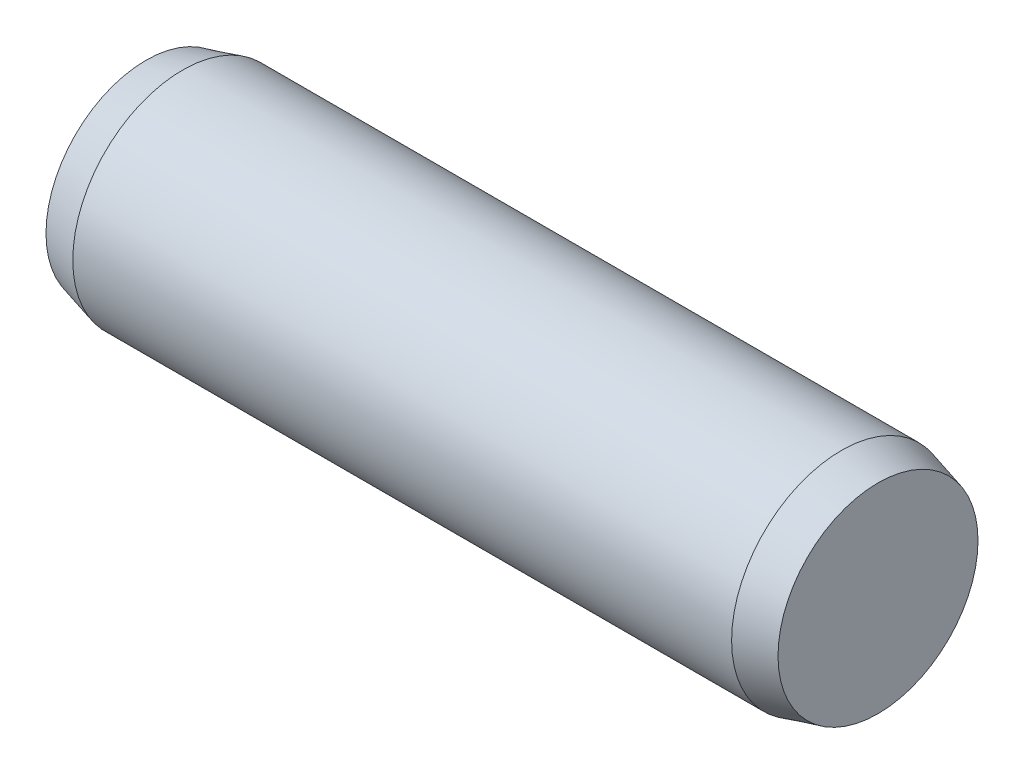
ISO-10303-21;
HEADER;
FILE_DESCRIPTION(('STEP AP214'),'2;1');
FILE_NAME('part.step','',(''),(''),'','','');
FILE_SCHEMA(('AUTOMOTIVE_DESIGN { 1 0 10303 214 1 1 1 1 }'));
ENDSEC;
DATA;
#1=APPLICATION_CONTEXT('core data for automotive mechanical design processes');
#2=APPLICATION_PROTOCOL_DEFINITION('international standard','automotive_design',2000,#1);
#3=PRODUCT_CONTEXT('',#1,'mechanical');
#4=PRODUCT('Part','Part','',(#3));
#5=PRODUCT_RELATED_PRODUCT_CATEGORY('part','',(#4));
#6=PRODUCT_DEFINITION_FORMATION('','',#4);
#7=PRODUCT_DEFINITION_CONTEXT('part definition',#1,'design');
#8=PRODUCT_DEFINITION('design','',#6,#7);
#9=PRODUCT_DEFINITION_SHAPE('','',#8);
#10=(LENGTH_UNIT() NAMED_UNIT(*) SI_UNIT(.MILLI.,.METRE.));
#11=(NAMED_UNIT(*) PLANE_ANGLE_UNIT() SI_UNIT($,.RADIAN.));
#12=(NAMED_UNIT(*) SI_UNIT($,.STERADIAN.) SOLID_ANGLE_UNIT());
#13=UNCERTAINTY_MEASURE_WITH_UNIT(LENGTH_MEASURE(1.E-05),#10,'distance_accuracy_value','');
#14=(GEOMETRIC_REPRESENTATION_CONTEXT(3) GLOBAL_UNCERTAINTY_ASSIGNED_CONTEXT((#13)) GLOBAL_UNIT_ASSIGNED_CONTEXT((#10,
#11,#12)) REPRESENTATION_CONTEXT('',''));
#15=CARTESIAN_POINT('',(0.,0.,0.));
#16=DIRECTION('',(0.,0.,1.));
#17=DIRECTION('',(1.,0.,0.));
#18=AXIS2_PLACEMENT_3D('',#15,#16,#17);
#19=CARTESIAN_POINT('',(0.,1.36602540378444,0.));
#20=DIRECTION('',(1.,0.,0.));
#21=DIRECTION('',(0.,0.,-1.));
#22=AXIS2_PLACEMENT_3D('',#19,#20,#21);
#23=PLANE('',#22);
#24=CARTESIAN_POINT('',(0.,0.,0.));
#25=DIRECTION('',(-1.,0.,0.));
#26=DIRECTION('',(0.,0.,1.));
#27=AXIS2_PLACEMENT_3D('',#24,#25,#26);
#28=CIRCLE('',#27,1.36602540378444);
#29=CARTESIAN_POINT('',(0.,0.,1.36602540378444));
#30=VERTEX_POINT('',#29);
#31=EDGE_CURVE('E45',#30,#30,#28,.T.);
#32=ORIENTED_EDGE('',*,*,#31,.T.);
#33=EDGE_LOOP('',(#32));
#34=FACE_BOUND('',#33,.T.);
#35=ADVANCED_FACE('F31',(#34),#23,.F.);
#36=CARTESIAN_POINT('',(10.,0.,0.));
#37=DIRECTION('',(-1.,0.,0.));
#38=DIRECTION('',(0.,0.,1.));
#39=AXIS2_PLACEMENT_3D('',#36,#37,#38);
#40=PLANE('',#39);
#41=CARTESIAN_POINT('',(10.,0.,0.));
#42=DIRECTION('',(-1.,0.,0.));
#43=DIRECTION('',(0.,0.,1.));
#44=AXIS2_PLACEMENT_3D('',#41,#42,#43);
#45=CIRCLE('',#44,1.36602540378444);
#46=CARTESIAN_POINT('',(10.,0.,1.36602540378444));
#47=VERTEX_POINT('',#46);
#48=EDGE_CURVE('E10',#47,#47,#45,.T.);
#49=ORIENTED_EDGE('',*,*,#48,.F.);
#50=EDGE_LOOP('',(#49));
#51=FACE_BOUND('',#50,.T.);
#52=ADVANCED_FACE('F65',(#51),#40,.F.);
#53=CARTESIAN_POINT('',(10.,0.,0.));
#54=DIRECTION('',(-1.,0.,0.));
#55=DIRECTION('',(0.,0.,1.));
#56=AXIS2_PLACEMENT_3D('',#53,#54,#55);
#57=CONICAL_SURFACE('',#56,1.36602540378444,0.26179938779915);
#58=CARTESIAN_POINT('',(9.5,0.,0.));
#59=DIRECTION('',(-1.,0.,0.));
#60=DIRECTION('',(0.,0.,1.));
#61=AXIS2_PLACEMENT_3D('',#58,#59,#60);
#62=CIRCLE('',#61,1.5);
#63=CARTESIAN_POINT('',(9.5,0.,1.5));
#64=VERTEX_POINT('',#63);
#65=EDGE_CURVE('E37',#64,#64,#62,.T.);
#66=ORIENTED_EDGE('',*,*,#65,.F.);
#67=EDGE_LOOP('',(#66));
#68=FACE_BOUND('',#67,.T.);
#69=ORIENTED_EDGE('',*,*,#48,.T.);
#70=EDGE_LOOP('',(#69));
#71=FACE_BOUND('',#70,.T.);
#72=ADVANCED_FACE('F60',(#68,#71),#57,.T.);
#73=CARTESIAN_POINT('',(-6.97668367754887,0.,0.));
#74=DIRECTION('',(-1.,0.,0.));
#75=DIRECTION('',(0.,0.,1.));
#76=AXIS2_PLACEMENT_3D('',#73,#74,#75);
#77=CYLINDRICAL_SURFACE('',#76,1.5);
#78=CARTESIAN_POINT('',(0.5,0.,0.));
#79=DIRECTION('',(-1.,0.,0.));
#80=DIRECTION('',(0.,0.,1.));
#81=AXIS2_PLACEMENT_3D('',#78,#79,#80);
#82=CIRCLE('',#81,1.5);
#83=CARTESIAN_POINT('',(0.5,0.,1.5));
#84=VERTEX_POINT('',#83);
#85=EDGE_CURVE('E41',#84,#84,#82,.T.);
#86=ORIENTED_EDGE('',*,*,#85,.F.);
#87=EDGE_LOOP('',(#86));
#88=FACE_BOUND('',#87,.T.);
#89=ORIENTED_EDGE('',*,*,#65,.T.);
#90=EDGE_LOOP('',(#89));
#91=FACE_BOUND('',#90,.T.);
#92=ADVANCED_FACE('F55',(#88,#91),#77,.T.);
#93=CARTESIAN_POINT('',(0.5,0.,0.));
#94=DIRECTION('',(1.,0.,0.));
#95=DIRECTION('',(0.,0.,-1.));
#96=AXIS2_PLACEMENT_3D('',#93,#94,#95);
#97=CONICAL_SURFACE('',#96,1.5,0.261799387799151);
#98=ORIENTED_EDGE('',*,*,#31,.F.);
#99=EDGE_LOOP('',(#98));
#100=FACE_BOUND('',#99,.T.);
#101=ORIENTED_EDGE('',*,*,#85,.T.);
#102=EDGE_LOOP('',(#101));
#103=FACE_BOUND('',#102,.T.);
#104=ADVANCED_FACE('F52',(#100,#103),#97,.T.);
#105=CLOSED_SHELL('',(#35,#52,#72,#92,#104));
#106=MANIFOLD_SOLID_BREP('B2',#105);
#107=ADVANCED_BREP_SHAPE_REPRESENTATION('',(#18,#106),#14);
#108=SHAPE_DEFINITION_REPRESENTATION(#9,#107);
ENDSEC;
END-ISO-10303-21;
